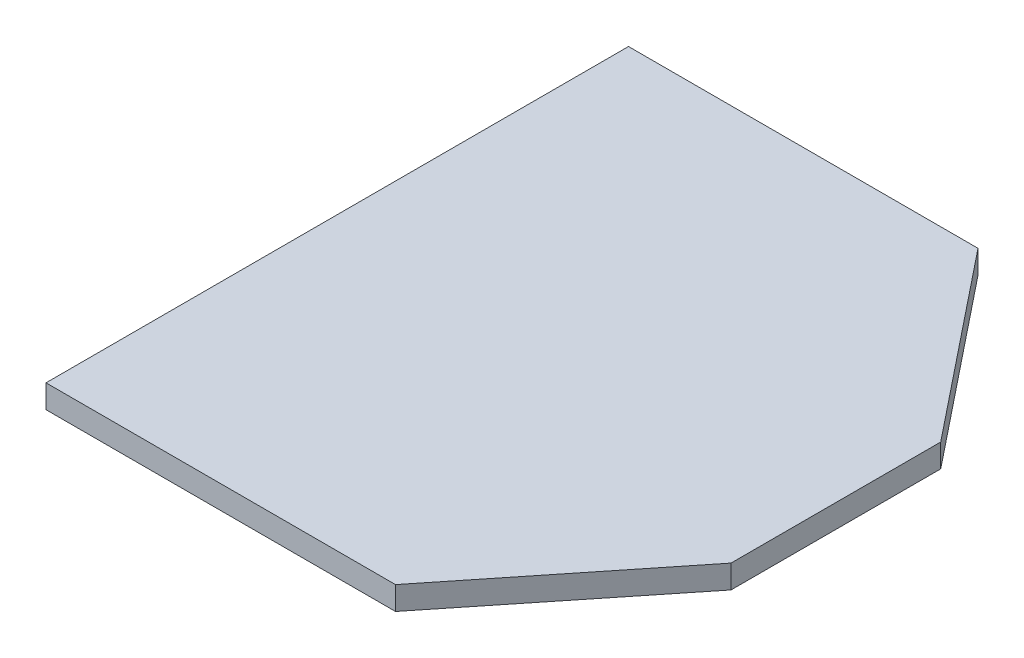
ISO-10303-21;
HEADER;
FILE_DESCRIPTION(('STEP AP214'),'2;1');
FILE_NAME('part.step','',(''),(''),'','','');
FILE_SCHEMA(('AUTOMOTIVE_DESIGN { 1 0 10303 214 1 1 1 1 }'));
ENDSEC;
DATA;
#1=APPLICATION_CONTEXT('core data for automotive mechanical design processes');
#2=APPLICATION_PROTOCOL_DEFINITION('international standard','automotive_design',2000,#1);
#3=PRODUCT_CONTEXT('',#1,'mechanical');
#4=PRODUCT('Part','Part','',(#3));
#5=PRODUCT_RELATED_PRODUCT_CATEGORY('part','',(#4));
#6=PRODUCT_DEFINITION_FORMATION('','',#4);
#7=PRODUCT_DEFINITION_CONTEXT('part definition',#1,'design');
#8=PRODUCT_DEFINITION('design','',#6,#7);
#9=PRODUCT_DEFINITION_SHAPE('','',#8);
#10=(LENGTH_UNIT() NAMED_UNIT(*) SI_UNIT(.MILLI.,.METRE.));
#11=(NAMED_UNIT(*) PLANE_ANGLE_UNIT() SI_UNIT($,.RADIAN.));
#12=(NAMED_UNIT(*) SI_UNIT($,.STERADIAN.) SOLID_ANGLE_UNIT());
#13=UNCERTAINTY_MEASURE_WITH_UNIT(LENGTH_MEASURE(1.E-05),#10,'distance_accuracy_value','');
#14=(GEOMETRIC_REPRESENTATION_CONTEXT(3) GLOBAL_UNCERTAINTY_ASSIGNED_CONTEXT((#13)) GLOBAL_UNIT_ASSIGNED_CONTEXT((#10,
#11,#12)) REPRESENTATION_CONTEXT('',''));
#15=CARTESIAN_POINT('',(0.,0.,0.));
#16=DIRECTION('',(0.,0.,1.));
#17=DIRECTION('',(1.,0.,0.));
#18=AXIS2_PLACEMENT_3D('',#15,#16,#17);
#19=CARTESIAN_POINT('',(-75.,5.,-125.));
#20=DIRECTION('',(0.,0.,1.));
#21=DIRECTION('',(1.,0.,0.));
#22=AXIS2_PLACEMENT_3D('',#19,#20,#21);
#23=PLANE('',#22);
#24=DIRECTION('',(-1.,0.,0.));
#25=VECTOR('',#24,1.);
#26=CARTESIAN_POINT('',(-75.,-5.,-125.));
#27=LINE('',#26,#25);
#28=CARTESIAN_POINT('',(75.,-5.,-125.));
#29=VERTEX_POINT('',#28);
#30=CARTESIAN_POINT('',(-75.,-5.,-125.));
#31=VERTEX_POINT('',#30);
#32=EDGE_CURVE('E108',#29,#31,#27,.T.);
#33=ORIENTED_EDGE('',*,*,#32,.T.);
#34=DIRECTION('',(0.,-1.,0.));
#35=VECTOR('',#34,1.);
#36=CARTESIAN_POINT('',(-75.,5.,-125.));
#37=LINE('',#36,#35);
#38=CARTESIAN_POINT('',(-75.,5.,-125.));
#39=VERTEX_POINT('',#38);
#40=EDGE_CURVE('E11',#39,#31,#37,.T.);
#41=ORIENTED_EDGE('',*,*,#40,.F.);
#42=DIRECTION('',(-1.,0.,0.));
#43=VECTOR('',#42,1.);
#44=CARTESIAN_POINT('',(-75.,5.,-125.));
#45=LINE('',#44,#43);
#46=CARTESIAN_POINT('',(75.,5.,-125.));
#47=VERTEX_POINT('',#46);
#48=EDGE_CURVE('E109',#47,#39,#45,.T.);
#49=ORIENTED_EDGE('',*,*,#48,.F.);
#50=DIRECTION('',(0.,-1.,0.));
#51=VECTOR('',#50,1.);
#52=CARTESIAN_POINT('',(75.,5.,-125.));
#53=LINE('',#52,#51);
#54=EDGE_CURVE('E117',#47,#29,#53,.T.);
#55=ORIENTED_EDGE('',*,*,#54,.T.);
#56=EDGE_LOOP('',(#33,#41,#49,#55));
#57=FACE_BOUND('',#56,.T.);
#58=ADVANCED_FACE('F36',(#57),#23,.F.);
#59=CARTESIAN_POINT('',(-75.,5.,125.));
#60=DIRECTION('',(1.,0.,0.));
#61=DIRECTION('',(0.,0.,-1.));
#62=AXIS2_PLACEMENT_3D('',#59,#60,#61);
#63=PLANE('',#62);
#64=DIRECTION('',(0.,0.,1.));
#65=VECTOR('',#64,1.);
#66=CARTESIAN_POINT('',(-75.,-5.,125.));
#67=LINE('',#66,#65);
#68=CARTESIAN_POINT('',(-75.,-5.,125.));
#69=VERTEX_POINT('',#68);
#70=EDGE_CURVE('E128',#31,#69,#67,.T.);
#71=ORIENTED_EDGE('',*,*,#70,.T.);
#72=DIRECTION('',(0.,-1.,0.));
#73=VECTOR('',#72,1.);
#74=CARTESIAN_POINT('',(-75.,5.,125.));
#75=LINE('',#74,#73);
#76=CARTESIAN_POINT('',(-75.,5.,125.));
#77=VERTEX_POINT('',#76);
#78=EDGE_CURVE('E43',#77,#69,#75,.T.);
#79=ORIENTED_EDGE('',*,*,#78,.F.);
#80=DIRECTION('',(0.,0.,1.));
#81=VECTOR('',#80,1.);
#82=CARTESIAN_POINT('',(-75.,5.,125.));
#83=LINE('',#82,#81);
#84=EDGE_CURVE('E88',#39,#77,#83,.T.);
#85=ORIENTED_EDGE('',*,*,#84,.F.);
#86=ORIENTED_EDGE('',*,*,#40,.T.);
#87=EDGE_LOOP('',(#71,#79,#85,#86));
#88=FACE_BOUND('',#87,.T.);
#89=ADVANCED_FACE('F146',(#88),#63,.F.);
#90=CARTESIAN_POINT('',(-75.,5.,125.));
#91=DIRECTION('',(0.,0.,-1.));
#92=DIRECTION('',(-1.,0.,0.));
#93=AXIS2_PLACEMENT_3D('',#90,#91,#92);
#94=PLANE('',#93);
#95=DIRECTION('',(1.,0.,0.));
#96=VECTOR('',#95,1.);
#97=CARTESIAN_POINT('',(-75.,-5.,125.));
#98=LINE('',#97,#96);
#99=CARTESIAN_POINT('',(75.,-5.,125.));
#100=VERTEX_POINT('',#99);
#101=EDGE_CURVE('E113',#69,#100,#98,.T.);
#102=ORIENTED_EDGE('',*,*,#101,.T.);
#103=DIRECTION('',(0.,-1.,0.));
#104=VECTOR('',#103,1.);
#105=CARTESIAN_POINT('',(75.,5.,125.));
#106=LINE('',#105,#104);
#107=CARTESIAN_POINT('',(75.,5.,125.));
#108=VERTEX_POINT('',#107);
#109=EDGE_CURVE('E119',#108,#100,#106,.T.);
#110=ORIENTED_EDGE('',*,*,#109,.F.);
#111=DIRECTION('',(1.,0.,0.));
#112=VECTOR('',#111,1.);
#113=CARTESIAN_POINT('',(-75.,5.,125.));
#114=LINE('',#113,#112);
#115=EDGE_CURVE('E127',#77,#108,#114,.T.);
#116=ORIENTED_EDGE('',*,*,#115,.F.);
#117=ORIENTED_EDGE('',*,*,#78,.T.);
#118=EDGE_LOOP('',(#102,#110,#116,#117));
#119=FACE_BOUND('',#118,.T.);
#120=ADVANCED_FACE('F125',(#119),#94,.F.);
#121=CARTESIAN_POINT('',(175.,5.,0.));
#122=DIRECTION('',(-0.78086880944303,0.,-0.624695047554425));
#123=DIRECTION('',(-0.624695047554425,0.,0.78086880944303));
#124=AXIS2_PLACEMENT_3D('',#121,#122,#123);
#125=PLANE('',#124);
#126=DIRECTION('',(0.624695047554425,0.,-0.78086880944303));
#127=VECTOR('',#126,1.);
#128=CARTESIAN_POINT('',(175.,-5.,0.));
#129=LINE('',#128,#127);
#130=CARTESIAN_POINT('',(139.,-5.,45.));
#131=VERTEX_POINT('',#130);
#132=EDGE_CURVE('E110',#100,#131,#129,.T.);
#133=ORIENTED_EDGE('',*,*,#132,.T.);
#134=DIRECTION('',(0.,1.,0.));
#135=VECTOR('',#134,1.);
#136=CARTESIAN_POINT('',(139.,-5.,45.));
#137=LINE('',#136,#135);
#138=CARTESIAN_POINT('',(139.,5.,45.));
#139=VERTEX_POINT('',#138);
#140=EDGE_CURVE('E50',#131,#139,#137,.T.);
#141=ORIENTED_EDGE('',*,*,#140,.T.);
#142=DIRECTION('',(0.624695047554425,0.,-0.78086880944303));
#143=VECTOR('',#142,1.);
#144=CARTESIAN_POINT('',(175.,5.,0.));
#145=LINE('',#144,#143);
#146=EDGE_CURVE('E133',#108,#139,#145,.T.);
#147=ORIENTED_EDGE('',*,*,#146,.F.);
#148=ORIENTED_EDGE('',*,*,#109,.T.);
#149=EDGE_LOOP('',(#133,#141,#147,#148));
#150=FACE_BOUND('',#149,.T.);
#151=ADVANCED_FACE('F141',(#150),#125,.F.);
#152=CARTESIAN_POINT('',(75.,5.,-125.));
#153=DIRECTION('',(-0.78086880944303,0.,0.624695047554424));
#154=DIRECTION('',(0.624695047554424,0.,0.78086880944303));
#155=AXIS2_PLACEMENT_3D('',#152,#153,#154);
#156=PLANE('',#155);
#157=DIRECTION('',(-0.624695047554424,0.,-0.78086880944303));
#158=VECTOR('',#157,1.);
#159=CARTESIAN_POINT('',(75.,5.,-125.));
#160=LINE('',#159,#158);
#161=CARTESIAN_POINT('',(139.,5.,-45.));
#162=VERTEX_POINT('',#161);
#163=EDGE_CURVE('E59',#162,#47,#160,.T.);
#164=ORIENTED_EDGE('',*,*,#163,.F.);
#165=DIRECTION('',(0.,1.,0.));
#166=VECTOR('',#165,1.);
#167=CARTESIAN_POINT('',(139.,-5.,-45.));
#168=LINE('',#167,#166);
#169=CARTESIAN_POINT('',(139.,-5.,-45.));
#170=VERTEX_POINT('',#169);
#171=EDGE_CURVE('E97',#170,#162,#168,.T.);
#172=ORIENTED_EDGE('',*,*,#171,.F.);
#173=DIRECTION('',(-0.624695047554424,0.,-0.78086880944303));
#174=VECTOR('',#173,1.);
#175=CARTESIAN_POINT('',(75.,-5.,-125.));
#176=LINE('',#175,#174);
#177=EDGE_CURVE('E81',#170,#29,#176,.T.);
#178=ORIENTED_EDGE('',*,*,#177,.T.);
#179=ORIENTED_EDGE('',*,*,#54,.F.);
#180=EDGE_LOOP('',(#164,#172,#178,#179));
#181=FACE_BOUND('',#180,.T.);
#182=ADVANCED_FACE('F103',(#181),#156,.F.);
#183=CARTESIAN_POINT('',(0.,5.,0.));
#184=DIRECTION('',(0.,1.,0.));
#185=DIRECTION('',(0.,0.,1.));
#186=AXIS2_PLACEMENT_3D('',#183,#184,#185);
#187=PLANE('',#186);
#188=DIRECTION('',(0.,0.,1.));
#189=VECTOR('',#188,1.);
#190=CARTESIAN_POINT('',(139.,5.,-45.));
#191=LINE('',#190,#189);
#192=EDGE_CURVE('E101',#162,#139,#191,.T.);
#193=ORIENTED_EDGE('',*,*,#192,.F.);
#194=ORIENTED_EDGE('',*,*,#163,.T.);
#195=ORIENTED_EDGE('',*,*,#48,.T.);
#196=ORIENTED_EDGE('',*,*,#84,.T.);
#197=ORIENTED_EDGE('',*,*,#115,.T.);
#198=ORIENTED_EDGE('',*,*,#146,.T.);
#199=EDGE_LOOP('',(#193,#194,#195,#196,#197,#198));
#200=FACE_BOUND('',#199,.T.);
#201=ADVANCED_FACE('F142',(#200),#187,.T.);
#202=CARTESIAN_POINT('',(0.,-5.,0.));
#203=DIRECTION('',(0.,1.,0.));
#204=DIRECTION('',(0.,0.,1.));
#205=AXIS2_PLACEMENT_3D('',#202,#203,#204);
#206=PLANE('',#205);
#207=ORIENTED_EDGE('',*,*,#177,.F.);
#208=DIRECTION('',(0.,0.,1.));
#209=VECTOR('',#208,1.);
#210=CARTESIAN_POINT('',(139.,-5.,-45.));
#211=LINE('',#210,#209);
#212=EDGE_CURVE('E95',#170,#131,#211,.T.);
#213=ORIENTED_EDGE('',*,*,#212,.T.);
#214=ORIENTED_EDGE('',*,*,#132,.F.);
#215=ORIENTED_EDGE('',*,*,#101,.F.);
#216=ORIENTED_EDGE('',*,*,#70,.F.);
#217=ORIENTED_EDGE('',*,*,#32,.F.);
#218=EDGE_LOOP('',(#207,#213,#214,#215,#216,#217));
#219=FACE_BOUND('',#218,.T.);
#220=ADVANCED_FACE('F106',(#219),#206,.F.);
#221=CARTESIAN_POINT('',(139.,-5.,-45.));
#222=DIRECTION('',(-1.,0.,0.));
#223=DIRECTION('',(0.,0.,1.));
#224=AXIS2_PLACEMENT_3D('',#221,#222,#223);
#225=PLANE('',#224);
#226=ORIENTED_EDGE('',*,*,#192,.T.);
#227=ORIENTED_EDGE('',*,*,#140,.F.);
#228=ORIENTED_EDGE('',*,*,#212,.F.);
#229=ORIENTED_EDGE('',*,*,#171,.T.);
#230=EDGE_LOOP('',(#226,#227,#228,#229));
#231=FACE_BOUND('',#230,.T.);
#232=ADVANCED_FACE('F96',(#231),#225,.F.);
#233=CLOSED_SHELL('',(#58,#89,#120,#151,#182,#201,#220,#232));
#234=MANIFOLD_SOLID_BREP('B2',#233);
#235=ADVANCED_BREP_SHAPE_REPRESENTATION('',(#18,#234),#14);
#236=SHAPE_DEFINITION_REPRESENTATION(#9,#235);
ENDSEC;
END-ISO-10303-21;
